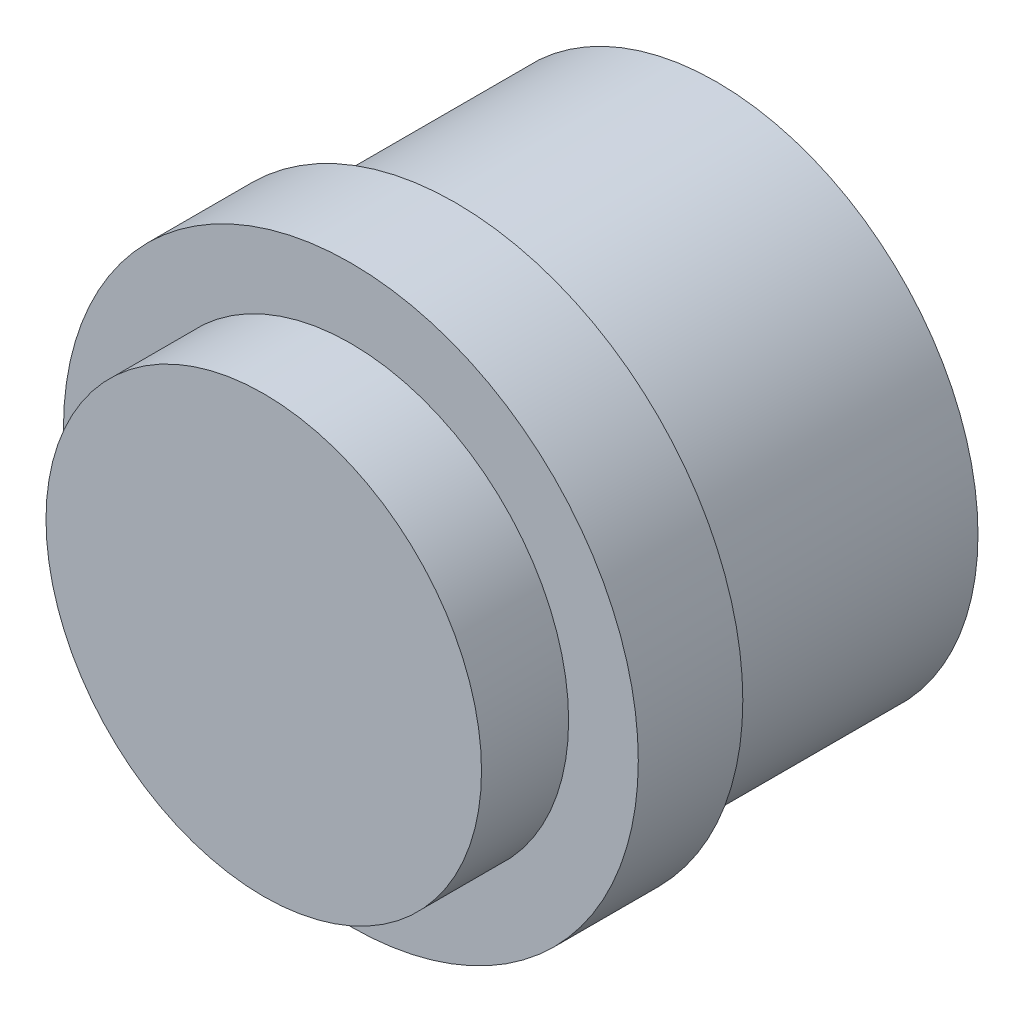
ISO-10303-21;
HEADER;
FILE_DESCRIPTION(('STEP AP214'),'2;1');
FILE_NAME('part.step','',(''),(''),'','','');
FILE_SCHEMA(('AUTOMOTIVE_DESIGN { 1 0 10303 214 1 1 1 1 }'));
ENDSEC;
DATA;
#1=APPLICATION_CONTEXT('core data for automotive mechanical design processes');
#2=APPLICATION_PROTOCOL_DEFINITION('international standard','automotive_design',2000,#1);
#3=PRODUCT_CONTEXT('',#1,'mechanical');
#4=PRODUCT('Part','Part','',(#3));
#5=PRODUCT_RELATED_PRODUCT_CATEGORY('part','',(#4));
#6=PRODUCT_DEFINITION_FORMATION('','',#4);
#7=PRODUCT_DEFINITION_CONTEXT('part definition',#1,'design');
#8=PRODUCT_DEFINITION('design','',#6,#7);
#9=PRODUCT_DEFINITION_SHAPE('','',#8);
#10=(LENGTH_UNIT() NAMED_UNIT(*) SI_UNIT(.MILLI.,.METRE.));
#11=(NAMED_UNIT(*) PLANE_ANGLE_UNIT() SI_UNIT($,.RADIAN.));
#12=(NAMED_UNIT(*) SI_UNIT($,.STERADIAN.) SOLID_ANGLE_UNIT());
#13=UNCERTAINTY_MEASURE_WITH_UNIT(LENGTH_MEASURE(1.E-05),#10,'distance_accuracy_value','');
#14=(GEOMETRIC_REPRESENTATION_CONTEXT(3) GLOBAL_UNCERTAINTY_ASSIGNED_CONTEXT((#13)) GLOBAL_UNIT_ASSIGNED_CONTEXT((#10,
#11,#12)) REPRESENTATION_CONTEXT('',''));
#15=CARTESIAN_POINT('',(0.,0.,0.));
#16=DIRECTION('',(0.,0.,1.));
#17=DIRECTION('',(1.,0.,0.));
#18=AXIS2_PLACEMENT_3D('',#15,#16,#17);
#19=CARTESIAN_POINT('',(0.,0.,26.));
#20=DIRECTION('',(0.,0.,-1.));
#21=DIRECTION('',(-1.,0.,0.));
#22=AXIS2_PLACEMENT_3D('',#19,#20,#21);
#23=CYLINDRICAL_SURFACE('',#22,16.5);
#24=CARTESIAN_POINT('',(0.,0.,21.));
#25=DIRECTION('',(0.,0.,1.));
#26=DIRECTION('',(1.,0.,0.));
#27=AXIS2_PLACEMENT_3D('',#24,#25,#26);
#28=CIRCLE('',#27,16.5);
#29=CARTESIAN_POINT('',(-16.5,0.,21.));
#30=VERTEX_POINT('',#29);
#31=EDGE_CURVE('E10',#30,#30,#28,.T.);
#32=CARTESIAN_POINT('',(0.,0.,15.));
#33=DIRECTION('',(0.,0.,-1.));
#34=DIRECTION('',(-1.,0.,0.));
#35=AXIS2_PLACEMENT_3D('',#32,#33,#34);
#36=CIRCLE('',#35,16.5);
#37=CARTESIAN_POINT('',(-16.5,0.,15.));
#38=VERTEX_POINT('',#37);
#39=EDGE_CURVE('E54',#38,#38,#36,.T.);
#40=CARTESIAN_POINT('',(-16.5,0.,21.));
#41=CARTESIAN_POINT('',(-16.5,0.,20.9375));
#42=CARTESIAN_POINT('',(-16.5,0.,20.875));
#43=CARTESIAN_POINT('',(-16.5,0.,20.75));
#44=CARTESIAN_POINT('',(-16.5,0.,20.6875));
#45=CARTESIAN_POINT('',(-16.5,0.,20.5625));
#46=CARTESIAN_POINT('',(-16.5,0.,20.5));
#47=CARTESIAN_POINT('',(-16.5,0.,20.375));
#48=CARTESIAN_POINT('',(-16.5,0.,20.3125));
#49=CARTESIAN_POINT('',(-16.5,0.,20.1875));
#50=CARTESIAN_POINT('',(-16.5,0.,20.125));
#51=CARTESIAN_POINT('',(-16.5,0.,20.));
#52=CARTESIAN_POINT('',(-16.5,0.,19.9375));
#53=CARTESIAN_POINT('',(-16.5,0.,19.8125));
#54=CARTESIAN_POINT('',(-16.5,0.,19.75));
#55=CARTESIAN_POINT('',(-16.5,0.,19.625));
#56=CARTESIAN_POINT('',(-16.5,0.,19.5625));
#57=CARTESIAN_POINT('',(-16.5,0.,19.4375));
#58=CARTESIAN_POINT('',(-16.5,0.,19.375));
#59=CARTESIAN_POINT('',(-16.5,0.,19.25));
#60=CARTESIAN_POINT('',(-16.5,0.,19.1875));
#61=CARTESIAN_POINT('',(-16.5,0.,19.0625));
#62=CARTESIAN_POINT('',(-16.5,0.,19.));
#63=CARTESIAN_POINT('',(-16.5,0.,18.875));
#64=CARTESIAN_POINT('',(-16.5,0.,18.8125));
#65=CARTESIAN_POINT('',(-16.5,0.,18.6875));
#66=CARTESIAN_POINT('',(-16.5,0.,18.625));
#67=CARTESIAN_POINT('',(-16.5,0.,18.5));
#68=CARTESIAN_POINT('',(-16.5,0.,18.4375));
#69=CARTESIAN_POINT('',(-16.5,0.,18.3125));
#70=CARTESIAN_POINT('',(-16.5,0.,18.25));
#71=CARTESIAN_POINT('',(-16.5,0.,18.125));
#72=CARTESIAN_POINT('',(-16.5,0.,18.0625));
#73=CARTESIAN_POINT('',(-16.5,0.,17.9375));
#74=CARTESIAN_POINT('',(-16.5,0.,17.875));
#75=CARTESIAN_POINT('',(-16.5,0.,17.75));
#76=CARTESIAN_POINT('',(-16.5,0.,17.6875));
#77=CARTESIAN_POINT('',(-16.5,0.,17.5625));
#78=CARTESIAN_POINT('',(-16.5,0.,17.5));
#79=CARTESIAN_POINT('',(-16.5,0.,17.375));
#80=CARTESIAN_POINT('',(-16.5,0.,17.3125));
#81=CARTESIAN_POINT('',(-16.5,0.,17.1875));
#82=CARTESIAN_POINT('',(-16.5,0.,17.125));
#83=CARTESIAN_POINT('',(-16.5,0.,17.));
#84=CARTESIAN_POINT('',(-16.5,0.,16.9375));
#85=CARTESIAN_POINT('',(-16.5,0.,16.8125));
#86=CARTESIAN_POINT('',(-16.5,0.,16.75));
#87=CARTESIAN_POINT('',(-16.5,0.,16.625));
#88=CARTESIAN_POINT('',(-16.5,0.,16.5625));
#89=CARTESIAN_POINT('',(-16.5,0.,16.4375));
#90=CARTESIAN_POINT('',(-16.5,0.,16.375));
#91=CARTESIAN_POINT('',(-16.5,0.,16.25));
#92=CARTESIAN_POINT('',(-16.5,0.,16.1875));
#93=CARTESIAN_POINT('',(-16.5,0.,16.0625));
#94=CARTESIAN_POINT('',(-16.5,0.,16.));
#95=CARTESIAN_POINT('',(-16.5,0.,15.875));
#96=CARTESIAN_POINT('',(-16.5,0.,15.8125));
#97=CARTESIAN_POINT('',(-16.5,0.,15.6875));
#98=CARTESIAN_POINT('',(-16.5,0.,15.625));
#99=CARTESIAN_POINT('',(-16.5,0.,15.5));
#100=CARTESIAN_POINT('',(-16.5,0.,15.4375));
#101=CARTESIAN_POINT('',(-16.5,0.,15.3125));
#102=CARTESIAN_POINT('',(-16.5,0.,15.25));
#103=CARTESIAN_POINT('',(-16.5,0.,15.125));
#104=CARTESIAN_POINT('',(-16.5,0.,15.0625));
#105=CARTESIAN_POINT('',(-16.5,0.,15.));
#106=B_SPLINE_CURVE_WITH_KNOTS('',3,(#40,#41,#42,#43,#44,#45,#46,#47,#48,#49,#50,#51,#52,#53,
#54,#55,#56,#57,#58,#59,#60,#61,#62,#63,#64,#65,#66,#67,#68,#69,#70,#71,#72,#73,#74,#75,#76,#77,
#78,#79,#80,#81,#82,#83,#84,#85,#86,#87,#88,#89,#90,#91,#92,#93,#94,#95,#96,#97,#98,#99,#100,
#101,#102,#103,#104,#105),.UNSPECIFIED.,.F.,.F.,(4,2,2,2,2,2,2,2,2,2,2,2,2,2,2,2,2,2,2,2,2,2,2,
2,2,2,2,2,2,2,2,2,4),(0.,0.1875,0.375,0.5625,0.750000000000001,0.937500000000001,1.125,1.3125,
1.5,1.6875,1.875,2.0625,2.25,2.4375,2.625,2.8125,3.,3.1875,3.375,3.5625,3.75,3.9375,4.125,
4.3125,4.5,4.6875,4.875,5.0625,5.25,5.4375,5.625,5.8125,6.),.UNSPECIFIED.);
#107=EDGE_CURVE('BSEAM39',#30,#38,#106,.T.);
#108=ORIENTED_EDGE('',*,*,#31,.F.);
#109=ORIENTED_EDGE('',*,*,#39,.F.);
#110=ORIENTED_EDGE('',*,*,#107,.T.);
#111=ORIENTED_EDGE('',*,*,#107,.F.);
#112=EDGE_LOOP('',(#108,#110,#109,#111));
#113=FACE_BOUND('',#112,.T.);
#114=ADVANCED_FACE('F39',(#113),#23,.T.);
#115=CARTESIAN_POINT('',(0.,0.,21.));
#116=DIRECTION('',(0.,0.,1.));
#117=DIRECTION('',(1.,0.,0.));
#118=AXIS2_PLACEMENT_3D('',#115,#116,#117);
#119=PLANE('',#118);
#120=CARTESIAN_POINT('',(0.,0.,21.));
#121=DIRECTION('',(0.,0.,1.));
#122=DIRECTION('',(1.,0.,0.));
#123=AXIS2_PLACEMENT_3D('',#120,#121,#122);
#124=CIRCLE('',#123,12.5);
#125=CARTESIAN_POINT('',(12.5,0.,21.));
#126=VERTEX_POINT('',#125);
#127=EDGE_CURVE('E45',#126,#126,#124,.T.);
#128=ORIENTED_EDGE('',*,*,#127,.F.);
#129=EDGE_LOOP('',(#128));
#130=FACE_BOUND('',#129,.T.);
#131=ORIENTED_EDGE('',*,*,#31,.T.);
#132=EDGE_LOOP('',(#131));
#133=FACE_BOUND('',#132,.T.);
#134=ADVANCED_FACE('F96',(#130,#133),#119,.T.);
#135=CARTESIAN_POINT('',(0.,0.,21.));
#136=DIRECTION('',(0.,0.,1.));
#137=DIRECTION('',(1.,0.,0.));
#138=AXIS2_PLACEMENT_3D('',#135,#136,#137);
#139=CYLINDRICAL_SURFACE('',#138,12.5);
#140=ORIENTED_EDGE('',*,*,#127,.T.);
#141=EDGE_LOOP('',(#140));
#142=FACE_BOUND('',#141,.T.);
#143=CARTESIAN_POINT('',(0.,0.,26.));
#144=DIRECTION('',(0.,0.,1.));
#145=DIRECTION('',(1.,0.,0.));
#146=AXIS2_PLACEMENT_3D('',#143,#144,#145);
#147=CIRCLE('',#146,12.5);
#148=CARTESIAN_POINT('',(12.5,0.,26.));
#149=VERTEX_POINT('',#148);
#150=EDGE_CURVE('E49',#149,#149,#147,.T.);
#151=ORIENTED_EDGE('',*,*,#150,.F.);
#152=EDGE_LOOP('',(#151));
#153=FACE_BOUND('',#152,.T.);
#154=ADVANCED_FACE('F102',(#142,#153),#139,.T.);
#155=CARTESIAN_POINT('',(0.,0.,26.));
#156=DIRECTION('',(0.,0.,1.));
#157=DIRECTION('',(1.,0.,0.));
#158=AXIS2_PLACEMENT_3D('',#155,#156,#157);
#159=PLANE('',#158);
#160=ORIENTED_EDGE('',*,*,#150,.T.);
#161=EDGE_LOOP('',(#160));
#162=FACE_BOUND('',#161,.T.);
#163=ADVANCED_FACE('F92',(#162),#159,.T.);
#164=CARTESIAN_POINT('',(0.,0.,15.));
#165=DIRECTION('',(0.,0.,-1.));
#166=DIRECTION('',(-1.,0.,0.));
#167=AXIS2_PLACEMENT_3D('',#164,#165,#166);
#168=PLANE('',#167);
#169=CARTESIAN_POINT('',(0.,0.,15.));
#170=DIRECTION('',(0.,0.,-1.));
#171=DIRECTION('',(-1.,0.,0.));
#172=AXIS2_PLACEMENT_3D('',#169,#170,#171);
#173=CIRCLE('',#172,15.);
#174=CARTESIAN_POINT('',(-15.,0.,15.));
#175=VERTEX_POINT('',#174);
#176=EDGE_CURVE('E58',#175,#175,#173,.T.);
#177=ORIENTED_EDGE('',*,*,#176,.F.);
#178=EDGE_LOOP('',(#177));
#179=FACE_BOUND('',#178,.T.);
#180=ORIENTED_EDGE('',*,*,#39,.T.);
#181=EDGE_LOOP('',(#180));
#182=FACE_BOUND('',#181,.T.);
#183=ADVANCED_FACE('F86',(#179,#182),#168,.T.);
#184=CARTESIAN_POINT('',(0.,0.,15.));
#185=DIRECTION('',(0.,0.,-1.));
#186=DIRECTION('',(-1.,0.,0.));
#187=AXIS2_PLACEMENT_3D('',#184,#185,#186);
#188=CYLINDRICAL_SURFACE('',#187,15.);
#189=ORIENTED_EDGE('',*,*,#176,.T.);
#190=EDGE_LOOP('',(#189));
#191=FACE_BOUND('',#190,.T.);
#192=CARTESIAN_POINT('',(0.,0.,0.));
#193=DIRECTION('',(0.,0.,-1.));
#194=DIRECTION('',(-1.,0.,0.));
#195=AXIS2_PLACEMENT_3D('',#192,#193,#194);
#196=CIRCLE('',#195,15.);
#197=CARTESIAN_POINT('',(-15.,0.,0.));
#198=VERTEX_POINT('',#197);
#199=EDGE_CURVE('E59',#198,#198,#196,.T.);
#200=ORIENTED_EDGE('',*,*,#199,.F.);
#201=EDGE_LOOP('',(#200));
#202=FACE_BOUND('',#201,.T.);
#203=ADVANCED_FACE('F82',(#191,#202),#188,.T.);
#204=CARTESIAN_POINT('',(0.,0.,0.));
#205=DIRECTION('',(0.,0.,1.));
#206=DIRECTION('',(1.,0.,0.));
#207=AXIS2_PLACEMENT_3D('',#204,#205,#206);
#208=PLANE('',#207);
#209=CARTESIAN_POINT('',(0.,0.,0.));
#210=DIRECTION('',(0.,0.,-1.));
#211=DIRECTION('',(-1.,0.,0.));
#212=AXIS2_PLACEMENT_3D('',#209,#210,#211);
#213=CIRCLE('',#212,12.5);
#214=CARTESIAN_POINT('',(-12.5,0.,0.));
#215=VERTEX_POINT('',#214);
#216=EDGE_CURVE('E65',#215,#215,#213,.T.);
#217=ORIENTED_EDGE('',*,*,#216,.F.);
#218=EDGE_LOOP('',(#217));
#219=FACE_BOUND('',#218,.T.);
#220=ORIENTED_EDGE('',*,*,#199,.T.);
#221=EDGE_LOOP('',(#220));
#222=FACE_BOUND('',#221,.T.);
#223=ADVANCED_FACE('F76',(#219,#222),#208,.F.);
#224=CARTESIAN_POINT('',(0.,0.,15.));
#225=DIRECTION('',(0.,0.,-1.));
#226=DIRECTION('',(-1.,0.,0.));
#227=AXIS2_PLACEMENT_3D('',#224,#225,#226);
#228=CYLINDRICAL_SURFACE('',#227,12.5);
#229=CARTESIAN_POINT('',(0.,0.,15.));
#230=DIRECTION('',(0.,0.,-1.));
#231=DIRECTION('',(-1.,0.,0.));
#232=AXIS2_PLACEMENT_3D('',#229,#230,#231);
#233=CIRCLE('',#232,12.5);
#234=CARTESIAN_POINT('',(-12.5,0.,15.));
#235=VERTEX_POINT('',#234);
#236=EDGE_CURVE('E62',#235,#235,#233,.T.);
#237=ORIENTED_EDGE('',*,*,#236,.F.);
#238=EDGE_LOOP('',(#237));
#239=FACE_BOUND('',#238,.T.);
#240=ORIENTED_EDGE('',*,*,#216,.T.);
#241=EDGE_LOOP('',(#240));
#242=FACE_BOUND('',#241,.T.);
#243=ADVANCED_FACE('F73',(#239,#242),#228,.F.);
#244=CARTESIAN_POINT('',(0.,0.,15.));
#245=DIRECTION('',(0.,0.,-1.));
#246=DIRECTION('',(-1.,0.,0.));
#247=AXIS2_PLACEMENT_3D('',#244,#245,#246);
#248=PLANE('',#247);
#249=ORIENTED_EDGE('',*,*,#236,.T.);
#250=EDGE_LOOP('',(#249));
#251=FACE_BOUND('',#250,.T.);
#252=ADVANCED_FACE('F71',(#251),#248,.T.);
#253=CLOSED_SHELL('',(#114,#134,#154,#163,#183,#203,#223,#243,#252));
#254=MANIFOLD_SOLID_BREP('B2',#253);
#255=ADVANCED_BREP_SHAPE_REPRESENTATION('',(#18,#254),#14);
#256=SHAPE_DEFINITION_REPRESENTATION(#9,#255);
ENDSEC;
END-ISO-10303-21;
